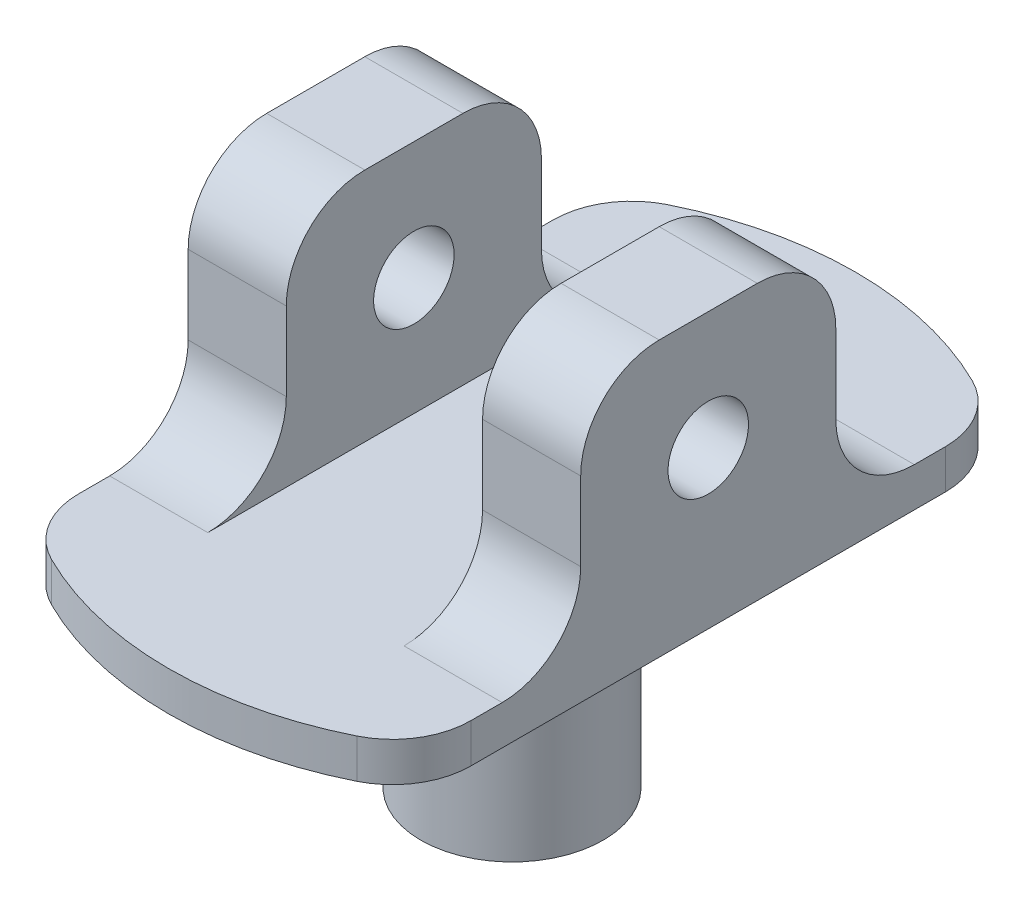
ISO-10303-21;
HEADER;
FILE_DESCRIPTION(('STEP AP214'),'2;1');
FILE_NAME('part.step','',(''),(''),'','','');
FILE_SCHEMA(('AUTOMOTIVE_DESIGN { 1 0 10303 214 1 1 1 1 }'));
ENDSEC;
DATA;
#1=APPLICATION_CONTEXT('core data for automotive mechanical design processes');
#2=APPLICATION_PROTOCOL_DEFINITION('international standard','automotive_design',2000,#1);
#3=PRODUCT_CONTEXT('',#1,'mechanical');
#4=PRODUCT('Part','Part','',(#3));
#5=PRODUCT_RELATED_PRODUCT_CATEGORY('part','',(#4));
#6=PRODUCT_DEFINITION_FORMATION('','',#4);
#7=PRODUCT_DEFINITION_CONTEXT('part definition',#1,'design');
#8=PRODUCT_DEFINITION('design','',#6,#7);
#9=PRODUCT_DEFINITION_SHAPE('','',#8);
#10=(LENGTH_UNIT() NAMED_UNIT(*) SI_UNIT(.MILLI.,.METRE.));
#11=(NAMED_UNIT(*) PLANE_ANGLE_UNIT() SI_UNIT($,.RADIAN.));
#12=(NAMED_UNIT(*) SI_UNIT($,.STERADIAN.) SOLID_ANGLE_UNIT());
#13=UNCERTAINTY_MEASURE_WITH_UNIT(LENGTH_MEASURE(1.E-05),#10,'distance_accuracy_value','');
#14=(GEOMETRIC_REPRESENTATION_CONTEXT(3) GLOBAL_UNCERTAINTY_ASSIGNED_CONTEXT((#13)) GLOBAL_UNIT_ASSIGNED_CONTEXT((#10,
#11,#12)) REPRESENTATION_CONTEXT('',''));
#15=CARTESIAN_POINT('',(0.,0.,0.));
#16=DIRECTION('',(0.,0.,1.));
#17=DIRECTION('',(1.,0.,0.));
#18=AXIS2_PLACEMENT_3D('',#15,#16,#17);
#19=CARTESIAN_POINT('',(0.,14.,0.));
#20=DIRECTION('',(0.,-1.,0.));
#21=DIRECTION('',(0.,0.,-1.));
#22=AXIS2_PLACEMENT_3D('',#19,#20,#21);
#23=CYLINDRICAL_SURFACE('',#22,17.5);
#24=CARTESIAN_POINT('',(0.,14.,0.));
#25=DIRECTION('',(0.,1.,0.));
#26=DIRECTION('',(0.,0.,1.));
#27=AXIS2_PLACEMENT_3D('',#24,#25,#26);
#28=CIRCLE('',#27,17.5);
#29=CARTESIAN_POINT('',(-7.77777777777778,14.,15.6766122883583));
#30=VERTEX_POINT('',#29);
#31=CARTESIAN_POINT('',(7.77777777777778,14.,15.6766122883583));
#32=VERTEX_POINT('',#31);
#33=EDGE_CURVE('E289',#30,#32,#28,.T.);
#34=ORIENTED_EDGE('',*,*,#33,.F.);
#35=DIRECTION('',(0.,-1.,0.));
#36=VECTOR('',#35,1.);
#37=CARTESIAN_POINT('',(-7.77777777777778,14.,15.6766122883583));
#38=LINE('',#37,#36);
#39=CARTESIAN_POINT('',(-7.77777777777778,12.,15.6766122883583));
#40=VERTEX_POINT('',#39);
#41=EDGE_CURVE('E11',#30,#40,#38,.T.);
#42=ORIENTED_EDGE('',*,*,#41,.T.);
#43=CARTESIAN_POINT('',(0.,12.,0.));
#44=DIRECTION('',(0.,1.,0.));
#45=DIRECTION('',(0.,0.,1.));
#46=AXIS2_PLACEMENT_3D('',#43,#44,#45);
#47=CIRCLE('',#46,17.5);
#48=CARTESIAN_POINT('',(7.77777777777778,12.,15.6766122883583));
#49=VERTEX_POINT('',#48);
#50=EDGE_CURVE('E291',#40,#49,#47,.T.);
#51=ORIENTED_EDGE('',*,*,#50,.T.);
#52=DIRECTION('',(0.,-1.,0.));
#53=VECTOR('',#52,1.);
#54=CARTESIAN_POINT('',(7.77777777777778,14.,15.6766122883583));
#55=LINE('',#54,#53);
#56=EDGE_CURVE('E40',#49,#32,#55,.F.);
#57=ORIENTED_EDGE('',*,*,#56,.T.);
#58=EDGE_LOOP('',(#34,#42,#51,#57));
#59=FACE_BOUND('',#58,.T.);
#60=ADVANCED_FACE('F32',(#59),#23,.T.);
#61=CARTESIAN_POINT('',(0.,14.,0.));
#62=DIRECTION('',(0.,1.,0.));
#63=DIRECTION('',(0.,0.,1.));
#64=AXIS2_PLACEMENT_3D('',#61,#62,#63);
#65=PLANE('',#64);
#66=DIRECTION('',(0.,0.,-1.));
#67=VECTOR('',#66,1.);
#68=CARTESIAN_POINT('',(10.,14.,0.));
#69=LINE('',#68,#67);
#70=CARTESIAN_POINT('',(10.,14.,-10.5));
#71=VERTEX_POINT('',#70);
#72=CARTESIAN_POINT('',(10.,14.,-12.0933866224478));
#73=VERTEX_POINT('',#72);
#74=EDGE_CURVE('E403',#71,#73,#69,.T.);
#75=ORIENTED_EDGE('',*,*,#74,.T.);
#76=CARTESIAN_POINT('',(6.,14.,-12.0933866224478));
#77=DIRECTION('',(0.,1.,0.));
#78=DIRECTION('',(0.,0.,1.));
#79=AXIS2_PLACEMENT_3D('',#76,#77,#78);
#80=CIRCLE('',#79,4.);
#81=CARTESIAN_POINT('',(7.77777777777777,14.,-15.6766122883583));
#82=VERTEX_POINT('',#81);
#83=EDGE_CURVE('E266',#73,#82,#80,.T.);
#84=ORIENTED_EDGE('',*,*,#83,.T.);
#85=CARTESIAN_POINT('',(-7.77777777777777,14.,-15.6766122883583));
#86=VERTEX_POINT('',#85);
#87=EDGE_CURVE('E296',#82,#86,#28,.T.);
#88=ORIENTED_EDGE('',*,*,#87,.T.);
#89=CARTESIAN_POINT('',(-6.,14.,-12.0933866224478));
#90=DIRECTION('',(0.,1.,0.));
#91=DIRECTION('',(0.,0.,1.));
#92=AXIS2_PLACEMENT_3D('',#89,#90,#91);
#93=CIRCLE('',#92,4.);
#94=CARTESIAN_POINT('',(-10.,14.,-12.0933866224478));
#95=VERTEX_POINT('',#94);
#96=EDGE_CURVE('E201',#86,#95,#93,.T.);
#97=ORIENTED_EDGE('',*,*,#96,.T.);
#98=DIRECTION('',(0.,0.,-1.));
#99=VECTOR('',#98,1.);
#100=CARTESIAN_POINT('',(-10.,14.,0.));
#101=LINE('',#100,#99);
#102=CARTESIAN_POINT('',(-10.,14.,-10.5));
#103=VERTEX_POINT('',#102);
#104=EDGE_CURVE('E193',#103,#95,#101,.T.);
#105=ORIENTED_EDGE('',*,*,#104,.F.);
#106=DIRECTION('',(-1.,0.,0.));
#107=VECTOR('',#106,1.);
#108=CARTESIAN_POINT('',(0.,14.,-10.5));
#109=LINE('',#108,#107);
#110=CARTESIAN_POINT('',(-5.,14.,-10.5));
#111=VERTEX_POINT('',#110);
#112=EDGE_CURVE('E198',#103,#111,#109,.F.);
#113=ORIENTED_EDGE('',*,*,#112,.T.);
#114=DIRECTION('',(0.,0.,1.));
#115=VECTOR('',#114,1.);
#116=CARTESIAN_POINT('',(-5.,14.,-6.5));
#117=LINE('',#116,#115);
#118=CARTESIAN_POINT('',(-5.,14.,10.5));
#119=VERTEX_POINT('',#118);
#120=EDGE_CURVE('E392',#111,#119,#117,.T.);
#121=ORIENTED_EDGE('',*,*,#120,.T.);
#122=DIRECTION('',(-1.,0.,0.));
#123=VECTOR('',#122,1.);
#124=CARTESIAN_POINT('',(-10.,14.,10.5));
#125=LINE('',#124,#123);
#126=CARTESIAN_POINT('',(-10.,14.,10.5));
#127=VERTEX_POINT('',#126);
#128=EDGE_CURVE('E218',#119,#127,#125,.T.);
#129=ORIENTED_EDGE('',*,*,#128,.T.);
#130=CARTESIAN_POINT('',(-10.,14.,12.0933866224478));
#131=VERTEX_POINT('',#130);
#132=EDGE_CURVE('E202',#131,#127,#101,.T.);
#133=ORIENTED_EDGE('',*,*,#132,.F.);
#134=CARTESIAN_POINT('',(-6.,14.,12.0933866224478));
#135=DIRECTION('',(0.,1.,0.));
#136=DIRECTION('',(0.,0.,1.));
#137=AXIS2_PLACEMENT_3D('',#134,#135,#136);
#138=CIRCLE('',#137,4.);
#139=EDGE_CURVE('E263',#131,#30,#138,.T.);
#140=ORIENTED_EDGE('',*,*,#139,.T.);
#141=ORIENTED_EDGE('',*,*,#33,.T.);
#142=CARTESIAN_POINT('',(6.,14.,12.0933866224478));
#143=DIRECTION('',(0.,1.,0.));
#144=DIRECTION('',(0.,0.,1.));
#145=AXIS2_PLACEMENT_3D('',#142,#143,#144);
#146=CIRCLE('',#145,4.);
#147=CARTESIAN_POINT('',(10.,14.,12.0933866224478));
#148=VERTEX_POINT('',#147);
#149=EDGE_CURVE('E261',#32,#148,#146,.T.);
#150=ORIENTED_EDGE('',*,*,#149,.T.);
#151=CARTESIAN_POINT('',(10.,14.,10.5));
#152=VERTEX_POINT('',#151);
#153=EDGE_CURVE('E350',#148,#152,#69,.T.);
#154=ORIENTED_EDGE('',*,*,#153,.T.);
#155=DIRECTION('',(1.,0.,0.));
#156=VECTOR('',#155,1.);
#157=CARTESIAN_POINT('',(0.,14.,10.5));
#158=LINE('',#157,#156);
#159=CARTESIAN_POINT('',(5.,14.,10.5));
#160=VERTEX_POINT('',#159);
#161=EDGE_CURVE('E224',#152,#160,#158,.F.);
#162=ORIENTED_EDGE('',*,*,#161,.T.);
#163=DIRECTION('',(0.,0.,1.));
#164=VECTOR('',#163,1.);
#165=CARTESIAN_POINT('',(5.,14.,-6.5));
#166=LINE('',#165,#164);
#167=CARTESIAN_POINT('',(5.,14.,-10.5));
#168=VERTEX_POINT('',#167);
#169=EDGE_CURVE('E349',#168,#160,#166,.T.);
#170=ORIENTED_EDGE('',*,*,#169,.F.);
#171=DIRECTION('',(1.,0.,0.));
#172=VECTOR('',#171,1.);
#173=CARTESIAN_POINT('',(10.,14.,-10.5));
#174=LINE('',#173,#172);
#175=EDGE_CURVE('E217',#168,#71,#174,.T.);
#176=ORIENTED_EDGE('',*,*,#175,.T.);
#177=EDGE_LOOP('',(#75,#84,#88,#97,#105,#113,#121,#129,#133,#140,#141,#150,#154,#162,#170,#176));
#178=FACE_BOUND('',#177,.T.);
#179=ADVANCED_FACE('F196',(#178),#65,.T.);
#180=ORIENTED_EDGE('',*,*,#87,.F.);
#181=DIRECTION('',(0.,-1.,0.));
#182=VECTOR('',#181,1.);
#183=CARTESIAN_POINT('',(7.77777777777778,14.,-15.6766122883583));
#184=LINE('',#183,#182);
#185=CARTESIAN_POINT('',(7.77777777777777,12.,-15.6766122883583));
#186=VERTEX_POINT('',#185);
#187=EDGE_CURVE('E271',#82,#186,#184,.T.);
#188=ORIENTED_EDGE('',*,*,#187,.T.);
#189=CARTESIAN_POINT('',(-7.77777777777777,12.,-15.6766122883583));
#190=VERTEX_POINT('',#189);
#191=EDGE_CURVE('E297',#186,#190,#47,.T.);
#192=ORIENTED_EDGE('',*,*,#191,.T.);
#193=DIRECTION('',(0.,-1.,0.));
#194=VECTOR('',#193,1.);
#195=CARTESIAN_POINT('',(-7.77777777777778,14.,-15.6766122883583));
#196=LINE('',#195,#194);
#197=EDGE_CURVE('E268',#190,#86,#196,.F.);
#198=ORIENTED_EDGE('',*,*,#197,.T.);
#199=EDGE_LOOP('',(#180,#188,#192,#198));
#200=FACE_BOUND('',#199,.T.);
#201=ADVANCED_FACE('F429',(#200),#23,.T.);
#202=CARTESIAN_POINT('',(0.,12.,0.));
#203=DIRECTION('',(0.,1.,0.));
#204=DIRECTION('',(0.,0.,1.));
#205=AXIS2_PLACEMENT_3D('',#202,#203,#204);
#206=PLANE('',#205);
#207=CARTESIAN_POINT('',(0.,12.,0.));
#208=DIRECTION('',(0.,1.,0.));
#209=DIRECTION('',(0.,0.,1.));
#210=AXIS2_PLACEMENT_3D('',#207,#208,#209);
#211=CIRCLE('',#210,4.65);
#212=CARTESIAN_POINT('',(0.,12.,4.65));
#213=VERTEX_POINT('',#212);
#214=EDGE_CURVE('E306',#213,#213,#211,.T.);
#215=ORIENTED_EDGE('',*,*,#214,.T.);
#216=EDGE_LOOP('',(#215));
#217=FACE_BOUND('',#216,.T.);
#218=ORIENTED_EDGE('',*,*,#191,.F.);
#219=CARTESIAN_POINT('',(6.,12.,-12.0933866224478));
#220=DIRECTION('',(0.,1.,0.));
#221=DIRECTION('',(0.,0.,1.));
#222=AXIS2_PLACEMENT_3D('',#219,#220,#221);
#223=CIRCLE('',#222,4.);
#224=CARTESIAN_POINT('',(10.,12.,-12.0933866224478));
#225=VERTEX_POINT('',#224);
#226=EDGE_CURVE('E278',#186,#225,#223,.F.);
#227=ORIENTED_EDGE('',*,*,#226,.T.);
#228=DIRECTION('',(0.,0.,-1.));
#229=VECTOR('',#228,1.);
#230=CARTESIAN_POINT('',(10.,12.,0.));
#231=LINE('',#230,#229);
#232=CARTESIAN_POINT('',(10.,12.,12.0933866224478));
#233=VERTEX_POINT('',#232);
#234=EDGE_CURVE('E395',#233,#225,#231,.T.);
#235=ORIENTED_EDGE('',*,*,#234,.F.);
#236=CARTESIAN_POINT('',(6.,12.,12.0933866224478));
#237=DIRECTION('',(0.,1.,0.));
#238=DIRECTION('',(0.,0.,1.));
#239=AXIS2_PLACEMENT_3D('',#236,#237,#238);
#240=CIRCLE('',#239,4.);
#241=EDGE_CURVE('E273',#233,#49,#240,.F.);
#242=ORIENTED_EDGE('',*,*,#241,.T.);
#243=ORIENTED_EDGE('',*,*,#50,.F.);
#244=CARTESIAN_POINT('',(-6.,12.,12.0933866224478));
#245=DIRECTION('',(0.,1.,0.));
#246=DIRECTION('',(0.,0.,1.));
#247=AXIS2_PLACEMENT_3D('',#244,#245,#246);
#248=CIRCLE('',#247,4.);
#249=CARTESIAN_POINT('',(-10.,12.,12.0933866224478));
#250=VERTEX_POINT('',#249);
#251=EDGE_CURVE('E54',#40,#250,#248,.F.);
#252=ORIENTED_EDGE('',*,*,#251,.T.);
#253=DIRECTION('',(0.,0.,-1.));
#254=VECTOR('',#253,1.);
#255=CARTESIAN_POINT('',(-10.,12.,0.));
#256=LINE('',#255,#254);
#257=CARTESIAN_POINT('',(-10.,12.,-12.0933866224478));
#258=VERTEX_POINT('',#257);
#259=EDGE_CURVE('E404',#250,#258,#256,.T.);
#260=ORIENTED_EDGE('',*,*,#259,.T.);
#261=CARTESIAN_POINT('',(-6.,12.,-12.0933866224478));
#262=DIRECTION('',(0.,1.,0.));
#263=DIRECTION('',(0.,0.,1.));
#264=AXIS2_PLACEMENT_3D('',#261,#262,#263);
#265=CIRCLE('',#264,4.);
#266=EDGE_CURVE('E276',#258,#190,#265,.F.);
#267=ORIENTED_EDGE('',*,*,#266,.T.);
#268=EDGE_LOOP('',(#218,#227,#235,#242,#243,#252,#260,#267));
#269=FACE_BOUND('',#268,.T.);
#270=ADVANCED_FACE('F435',(#217,#269),#206,.F.);
#271=CARTESIAN_POINT('',(0.,12.,0.));
#272=DIRECTION('',(0.,-1.,0.));
#273=DIRECTION('',(0.,0.,-1.));
#274=AXIS2_PLACEMENT_3D('',#271,#272,#273);
#275=CYLINDRICAL_SURFACE('',#274,4.65);
#276=ORIENTED_EDGE('',*,*,#214,.F.);
#277=EDGE_LOOP('',(#276));
#278=FACE_BOUND('',#277,.T.);
#279=CARTESIAN_POINT('',(0.,0.,0.));
#280=DIRECTION('',(0.,1.,0.));
#281=DIRECTION('',(0.,0.,1.));
#282=AXIS2_PLACEMENT_3D('',#279,#280,#281);
#283=CIRCLE('',#282,4.65);
#284=CARTESIAN_POINT('',(0.,0.,4.65));
#285=VERTEX_POINT('',#284);
#286=EDGE_CURVE('E299',#285,#285,#283,.T.);
#287=ORIENTED_EDGE('',*,*,#286,.T.);
#288=EDGE_LOOP('',(#287));
#289=FACE_BOUND('',#288,.T.);
#290=ADVANCED_FACE('F455',(#278,#289),#275,.T.);
#291=CARTESIAN_POINT('',(0.,0.,0.));
#292=DIRECTION('',(0.,1.,0.));
#293=DIRECTION('',(0.,0.,1.));
#294=AXIS2_PLACEMENT_3D('',#291,#292,#293);
#295=PLANE('',#294);
#296=ORIENTED_EDGE('',*,*,#286,.F.);
#297=EDGE_LOOP('',(#296));
#298=FACE_BOUND('',#297,.T.);
#299=ADVANCED_FACE('F460',(#298),#295,.F.);
#300=CARTESIAN_POINT('',(5.,26.,-6.5));
#301=DIRECTION('',(1.,0.,0.));
#302=DIRECTION('',(0.,0.,-1.));
#303=AXIS2_PLACEMENT_3D('',#300,#301,#302);
#304=PLANE('',#303);
#305=CARTESIAN_POINT('',(5.,20.,0.));
#306=DIRECTION('',(1.,0.,0.));
#307=DIRECTION('',(0.,0.,-1.));
#308=AXIS2_PLACEMENT_3D('',#305,#306,#307);
#309=CIRCLE('',#308,2.05);
#310=CARTESIAN_POINT('',(5.,20.,-2.05));
#311=VERTEX_POINT('',#310);
#312=EDGE_CURVE('E203',#311,#311,#309,.T.);
#313=ORIENTED_EDGE('',*,*,#312,.T.);
#314=EDGE_LOOP('',(#313));
#315=FACE_BOUND('',#314,.T.);
#316=DIRECTION('',(0.,0.,1.));
#317=VECTOR('',#316,1.);
#318=CARTESIAN_POINT('',(5.,26.,-6.5));
#319=LINE('',#318,#317);
#320=CARTESIAN_POINT('',(5.,26.,-2.5));
#321=VERTEX_POINT('',#320);
#322=CARTESIAN_POINT('',(5.,26.,2.5));
#323=VERTEX_POINT('',#322);
#324=EDGE_CURVE('E376',#321,#323,#319,.T.);
#325=ORIENTED_EDGE('',*,*,#324,.F.);
#326=CARTESIAN_POINT('',(5.,22.,-2.5));
#327=DIRECTION('',(1.,0.,0.));
#328=DIRECTION('',(0.,0.,-1.));
#329=AXIS2_PLACEMENT_3D('',#326,#327,#328);
#330=CIRCLE('',#329,4.);
#331=CARTESIAN_POINT('',(5.,22.,-6.5));
#332=VERTEX_POINT('',#331);
#333=EDGE_CURVE('E340',#321,#332,#330,.F.);
#334=ORIENTED_EDGE('',*,*,#333,.T.);
#335=DIRECTION('',(0.,-1.,0.));
#336=VECTOR('',#335,1.);
#337=CARTESIAN_POINT('',(5.,26.,-6.5));
#338=LINE('',#337,#336);
#339=CARTESIAN_POINT('',(5.,18.,-6.5));
#340=VERTEX_POINT('',#339);
#341=EDGE_CURVE('E369',#332,#340,#338,.T.);
#342=ORIENTED_EDGE('',*,*,#341,.T.);
#343=CARTESIAN_POINT('',(5.,18.,-10.5));
#344=DIRECTION('',(1.,0.,0.));
#345=DIRECTION('',(0.,0.,-1.));
#346=AXIS2_PLACEMENT_3D('',#343,#344,#345);
#347=CIRCLE('',#346,4.);
#348=EDGE_CURVE('E214',#340,#168,#347,.T.);
#349=ORIENTED_EDGE('',*,*,#348,.T.);
#350=ORIENTED_EDGE('',*,*,#169,.T.);
#351=CARTESIAN_POINT('',(5.,18.,10.5));
#352=DIRECTION('',(1.,0.,0.));
#353=DIRECTION('',(0.,0.,-1.));
#354=AXIS2_PLACEMENT_3D('',#351,#352,#353);
#355=CIRCLE('',#354,4.);
#356=CARTESIAN_POINT('',(5.,18.,6.5));
#357=VERTEX_POINT('',#356);
#358=EDGE_CURVE('E249',#160,#357,#355,.T.);
#359=ORIENTED_EDGE('',*,*,#358,.T.);
#360=DIRECTION('',(0.,-1.,0.));
#361=VECTOR('',#360,1.);
#362=CARTESIAN_POINT('',(5.,26.,6.5));
#363=LINE('',#362,#361);
#364=CARTESIAN_POINT('',(5.,22.,6.5));
#365=VERTEX_POINT('',#364);
#366=EDGE_CURVE('E303',#365,#357,#363,.T.);
#367=ORIENTED_EDGE('',*,*,#366,.F.);
#368=CARTESIAN_POINT('',(5.,22.,2.5));
#369=DIRECTION('',(1.,0.,0.));
#370=DIRECTION('',(0.,0.,-1.));
#371=AXIS2_PLACEMENT_3D('',#368,#369,#370);
#372=CIRCLE('',#371,4.);
#373=EDGE_CURVE('E338',#365,#323,#372,.F.);
#374=ORIENTED_EDGE('',*,*,#373,.T.);
#375=EDGE_LOOP('',(#325,#334,#342,#349,#350,#359,#367,#374));
#376=FACE_BOUND('',#375,.T.);
#377=ADVANCED_FACE('F358',(#315,#376),#304,.F.);
#378=CARTESIAN_POINT('',(5.,26.,6.5));
#379=DIRECTION('',(0.,0.,-1.));
#380=DIRECTION('',(-1.,0.,0.));
#381=AXIS2_PLACEMENT_3D('',#378,#379,#380);
#382=PLANE('',#381);
#383=ORIENTED_EDGE('',*,*,#366,.T.);
#384=DIRECTION('',(1.,0.,0.));
#385=VECTOR('',#384,1.);
#386=CARTESIAN_POINT('',(5.,18.,6.5));
#387=LINE('',#386,#385);
#388=CARTESIAN_POINT('',(10.,18.,6.5));
#389=VERTEX_POINT('',#388);
#390=EDGE_CURVE('E233',#357,#389,#387,.T.);
#391=ORIENTED_EDGE('',*,*,#390,.T.);
#392=DIRECTION('',(0.,-1.,0.));
#393=VECTOR('',#392,1.);
#394=CARTESIAN_POINT('',(10.,26.,6.5));
#395=LINE('',#394,#393);
#396=CARTESIAN_POINT('',(10.,22.,6.5));
#397=VERTEX_POINT('',#396);
#398=EDGE_CURVE('E365',#397,#389,#395,.T.);
#399=ORIENTED_EDGE('',*,*,#398,.F.);
#400=DIRECTION('',(1.,0.,0.));
#401=VECTOR('',#400,1.);
#402=CARTESIAN_POINT('',(5.,22.,6.5));
#403=LINE('',#402,#401);
#404=EDGE_CURVE('E342',#397,#365,#403,.F.);
#405=ORIENTED_EDGE('',*,*,#404,.T.);
#406=EDGE_LOOP('',(#383,#391,#399,#405));
#407=FACE_BOUND('',#406,.T.);
#408=ADVANCED_FACE('F361',(#407),#382,.F.);
#409=CARTESIAN_POINT('',(10.,26.,-6.5));
#410=DIRECTION('',(1.,0.,0.));
#411=DIRECTION('',(0.,0.,-1.));
#412=AXIS2_PLACEMENT_3D('',#409,#410,#411);
#413=PLANE('',#412);
#414=CARTESIAN_POINT('',(10.,20.,0.));
#415=DIRECTION('',(1.,0.,0.));
#416=DIRECTION('',(0.,0.,-1.));
#417=AXIS2_PLACEMENT_3D('',#414,#415,#416);
#418=CIRCLE('',#417,2.05);
#419=CARTESIAN_POINT('',(10.,20.,-2.05));
#420=VERTEX_POINT('',#419);
#421=EDGE_CURVE('E256',#420,#420,#418,.T.);
#422=ORIENTED_EDGE('',*,*,#421,.F.);
#423=EDGE_LOOP('',(#422));
#424=FACE_BOUND('',#423,.T.);
#425=ORIENTED_EDGE('',*,*,#234,.T.);
#426=DIRECTION('',(0.,1.,0.));
#427=VECTOR('',#426,1.);
#428=CARTESIAN_POINT('',(10.,14.,-12.0933866224478));
#429=LINE('',#428,#427);
#430=EDGE_CURVE('E258',#225,#73,#429,.T.);
#431=ORIENTED_EDGE('',*,*,#430,.T.);
#432=ORIENTED_EDGE('',*,*,#74,.F.);
#433=CARTESIAN_POINT('',(10.,18.,-10.5));
#434=DIRECTION('',(1.,0.,0.));
#435=DIRECTION('',(0.,0.,-1.));
#436=AXIS2_PLACEMENT_3D('',#433,#434,#435);
#437=CIRCLE('',#436,4.);
#438=CARTESIAN_POINT('',(10.,18.,-6.5));
#439=VERTEX_POINT('',#438);
#440=EDGE_CURVE('E236',#71,#439,#437,.F.);
#441=ORIENTED_EDGE('',*,*,#440,.T.);
#442=DIRECTION('',(0.,-1.,0.));
#443=VECTOR('',#442,1.);
#444=CARTESIAN_POINT('',(10.,26.,-6.5));
#445=LINE('',#444,#443);
#446=CARTESIAN_POINT('',(10.,22.,-6.5));
#447=VERTEX_POINT('',#446);
#448=EDGE_CURVE('E366',#447,#439,#445,.T.);
#449=ORIENTED_EDGE('',*,*,#448,.F.);
#450=CARTESIAN_POINT('',(10.,22.,-2.5));
#451=DIRECTION('',(1.,0.,0.));
#452=DIRECTION('',(0.,0.,-1.));
#453=AXIS2_PLACEMENT_3D('',#450,#451,#452);
#454=CIRCLE('',#453,4.);
#455=CARTESIAN_POINT('',(10.,26.,-2.5));
#456=VERTEX_POINT('',#455);
#457=EDGE_CURVE('E331',#447,#456,#454,.T.);
#458=ORIENTED_EDGE('',*,*,#457,.T.);
#459=DIRECTION('',(0.,0.,1.));
#460=VECTOR('',#459,1.);
#461=CARTESIAN_POINT('',(10.,26.,-6.5));
#462=LINE('',#461,#460);
#463=CARTESIAN_POINT('',(10.,26.,2.5));
#464=VERTEX_POINT('',#463);
#465=EDGE_CURVE('E374',#456,#464,#462,.T.);
#466=ORIENTED_EDGE('',*,*,#465,.T.);
#467=CARTESIAN_POINT('',(10.,22.,2.5));
#468=DIRECTION('',(1.,0.,0.));
#469=DIRECTION('',(0.,0.,-1.));
#470=AXIS2_PLACEMENT_3D('',#467,#468,#469);
#471=CIRCLE('',#470,4.);
#472=EDGE_CURVE('E329',#464,#397,#471,.T.);
#473=ORIENTED_EDGE('',*,*,#472,.T.);
#474=ORIENTED_EDGE('',*,*,#398,.T.);
#475=CARTESIAN_POINT('',(10.,18.,10.5));
#476=DIRECTION('',(1.,0.,0.));
#477=DIRECTION('',(0.,0.,-1.));
#478=AXIS2_PLACEMENT_3D('',#475,#476,#477);
#479=CIRCLE('',#478,4.);
#480=EDGE_CURVE('E246',#389,#152,#479,.F.);
#481=ORIENTED_EDGE('',*,*,#480,.T.);
#482=ORIENTED_EDGE('',*,*,#153,.F.);
#483=DIRECTION('',(0.,1.,0.));
#484=VECTOR('',#483,1.);
#485=CARTESIAN_POINT('',(10.,12.,12.0933866224478));
#486=LINE('',#485,#484);
#487=EDGE_CURVE('E251',#148,#233,#486,.F.);
#488=ORIENTED_EDGE('',*,*,#487,.T.);
#489=EDGE_LOOP('',(#425,#431,#432,#441,#449,#458,#466,#473,#474,#481,#482,#488));
#490=FACE_BOUND('',#489,.T.);
#491=ADVANCED_FACE('F416',(#424,#490),#413,.T.);
#492=CARTESIAN_POINT('',(5.,26.,-6.5));
#493=DIRECTION('',(0.,0.,-1.));
#494=DIRECTION('',(-1.,0.,0.));
#495=AXIS2_PLACEMENT_3D('',#492,#493,#494);
#496=PLANE('',#495);
#497=ORIENTED_EDGE('',*,*,#448,.T.);
#498=DIRECTION('',(1.,0.,0.));
#499=VECTOR('',#498,1.);
#500=CARTESIAN_POINT('',(5.,18.,-6.5));
#501=LINE('',#500,#499);
#502=EDGE_CURVE('E221',#439,#340,#501,.F.);
#503=ORIENTED_EDGE('',*,*,#502,.T.);
#504=ORIENTED_EDGE('',*,*,#341,.F.);
#505=DIRECTION('',(1.,0.,0.));
#506=VECTOR('',#505,1.);
#507=CARTESIAN_POINT('',(5.,22.,-6.5));
#508=LINE('',#507,#506);
#509=EDGE_CURVE('E326',#332,#447,#508,.T.);
#510=ORIENTED_EDGE('',*,*,#509,.T.);
#511=EDGE_LOOP('',(#497,#503,#504,#510));
#512=FACE_BOUND('',#511,.T.);
#513=ADVANCED_FACE('F418',(#512),#496,.T.);
#514=CARTESIAN_POINT('',(0.,26.,0.));
#515=DIRECTION('',(0.,1.,0.));
#516=DIRECTION('',(0.,0.,1.));
#517=AXIS2_PLACEMENT_3D('',#514,#515,#516);
#518=PLANE('',#517);
#519=ORIENTED_EDGE('',*,*,#465,.F.);
#520=DIRECTION('',(1.,0.,0.));
#521=VECTOR('',#520,1.);
#522=CARTESIAN_POINT('',(0.,26.,-2.5));
#523=LINE('',#522,#521);
#524=EDGE_CURVE('E336',#456,#321,#523,.F.);
#525=ORIENTED_EDGE('',*,*,#524,.T.);
#526=ORIENTED_EDGE('',*,*,#324,.T.);
#527=DIRECTION('',(1.,0.,0.));
#528=VECTOR('',#527,1.);
#529=CARTESIAN_POINT('',(10.,26.,2.5));
#530=LINE('',#529,#528);
#531=EDGE_CURVE('E333',#323,#464,#530,.T.);
#532=ORIENTED_EDGE('',*,*,#531,.T.);
#533=EDGE_LOOP('',(#519,#525,#526,#532));
#534=FACE_BOUND('',#533,.T.);
#535=ADVANCED_FACE('F471',(#534),#518,.T.);
#536=CARTESIAN_POINT('',(-5.,26.,-6.5));
#537=DIRECTION('',(1.,0.,0.));
#538=DIRECTION('',(0.,0.,-1.));
#539=AXIS2_PLACEMENT_3D('',#536,#537,#538);
#540=PLANE('',#539);
#541=CARTESIAN_POINT('',(-5.,20.,0.));
#542=DIRECTION('',(1.,0.,0.));
#543=DIRECTION('',(0.,0.,-1.));
#544=AXIS2_PLACEMENT_3D('',#541,#542,#543);
#545=CIRCLE('',#544,2.05);
#546=CARTESIAN_POINT('',(-5.,20.,-2.05));
#547=VERTEX_POINT('',#546);
#548=EDGE_CURVE('E255',#547,#547,#545,.T.);
#549=ORIENTED_EDGE('',*,*,#548,.F.);
#550=EDGE_LOOP('',(#549));
#551=FACE_BOUND('',#550,.T.);
#552=DIRECTION('',(0.,-1.,0.));
#553=VECTOR('',#552,1.);
#554=CARTESIAN_POINT('',(-5.,26.,-6.5));
#555=LINE('',#554,#553);
#556=CARTESIAN_POINT('',(-5.,22.,-6.5));
#557=VERTEX_POINT('',#556);
#558=CARTESIAN_POINT('',(-5.,18.,-6.5));
#559=VERTEX_POINT('',#558);
#560=EDGE_CURVE('E377',#557,#559,#555,.T.);
#561=ORIENTED_EDGE('',*,*,#560,.F.);
#562=CARTESIAN_POINT('',(-5.,22.,-2.5));
#563=DIRECTION('',(1.,0.,0.));
#564=DIRECTION('',(0.,0.,-1.));
#565=AXIS2_PLACEMENT_3D('',#562,#563,#564);
#566=CIRCLE('',#565,4.);
#567=CARTESIAN_POINT('',(-5.,26.,-2.5));
#568=VERTEX_POINT('',#567);
#569=EDGE_CURVE('E324',#557,#568,#566,.T.);
#570=ORIENTED_EDGE('',*,*,#569,.T.);
#571=DIRECTION('',(0.,0.,1.));
#572=VECTOR('',#571,1.);
#573=CARTESIAN_POINT('',(-5.,26.,-6.5));
#574=LINE('',#573,#572);
#575=CARTESIAN_POINT('',(-5.,26.,2.5));
#576=VERTEX_POINT('',#575);
#577=EDGE_CURVE('E394',#568,#576,#574,.T.);
#578=ORIENTED_EDGE('',*,*,#577,.T.);
#579=CARTESIAN_POINT('',(-5.,22.,2.5));
#580=DIRECTION('',(1.,0.,0.));
#581=DIRECTION('',(0.,0.,-1.));
#582=AXIS2_PLACEMENT_3D('',#579,#580,#581);
#583=CIRCLE('',#582,4.);
#584=CARTESIAN_POINT('',(-5.,22.,6.5));
#585=VERTEX_POINT('',#584);
#586=EDGE_CURVE('E322',#576,#585,#583,.T.);
#587=ORIENTED_EDGE('',*,*,#586,.T.);
#588=DIRECTION('',(0.,-1.,0.));
#589=VECTOR('',#588,1.);
#590=CARTESIAN_POINT('',(-5.,26.,6.5));
#591=LINE('',#590,#589);
#592=CARTESIAN_POINT('',(-5.,18.,6.5));
#593=VERTEX_POINT('',#592);
#594=EDGE_CURVE('E388',#585,#593,#591,.T.);
#595=ORIENTED_EDGE('',*,*,#594,.T.);
#596=CARTESIAN_POINT('',(-5.,18.,10.5));
#597=DIRECTION('',(1.,0.,0.));
#598=DIRECTION('',(0.,0.,-1.));
#599=AXIS2_PLACEMENT_3D('',#596,#597,#598);
#600=CIRCLE('',#599,4.);
#601=EDGE_CURVE('E243',#593,#119,#600,.F.);
#602=ORIENTED_EDGE('',*,*,#601,.T.);
#603=ORIENTED_EDGE('',*,*,#120,.F.);
#604=CARTESIAN_POINT('',(-5.,18.,-10.5));
#605=DIRECTION('',(1.,0.,0.));
#606=DIRECTION('',(0.,0.,-1.));
#607=AXIS2_PLACEMENT_3D('',#604,#605,#606);
#608=CIRCLE('',#607,4.);
#609=EDGE_CURVE('E213',#111,#559,#608,.F.);
#610=ORIENTED_EDGE('',*,*,#609,.T.);
#611=EDGE_LOOP('',(#561,#570,#578,#587,#595,#602,#603,#610));
#612=FACE_BOUND('',#611,.T.);
#613=ADVANCED_FACE('F475',(#551,#612),#540,.T.);
#614=CARTESIAN_POINT('',(-5.,26.,-6.5));
#615=DIRECTION('',(0.,0.,1.));
#616=DIRECTION('',(1.,0.,0.));
#617=AXIS2_PLACEMENT_3D('',#614,#615,#616);
#618=PLANE('',#617);
#619=ORIENTED_EDGE('',*,*,#560,.T.);
#620=DIRECTION('',(-1.,0.,0.));
#621=VECTOR('',#620,1.);
#622=CARTESIAN_POINT('',(-5.,18.,-6.5));
#623=LINE('',#622,#621);
#624=CARTESIAN_POINT('',(-10.,18.,-6.5));
#625=VERTEX_POINT('',#624);
#626=EDGE_CURVE('E229',#559,#625,#623,.T.);
#627=ORIENTED_EDGE('',*,*,#626,.T.);
#628=DIRECTION('',(0.,-1.,0.));
#629=VECTOR('',#628,1.);
#630=CARTESIAN_POINT('',(-10.,26.,-6.5));
#631=LINE('',#630,#629);
#632=CARTESIAN_POINT('',(-10.,22.,-6.5));
#633=VERTEX_POINT('',#632);
#634=EDGE_CURVE('E209',#633,#625,#631,.T.);
#635=ORIENTED_EDGE('',*,*,#634,.F.);
#636=DIRECTION('',(-1.,0.,0.));
#637=VECTOR('',#636,1.);
#638=CARTESIAN_POINT('',(-5.,22.,-6.5));
#639=LINE('',#638,#637);
#640=EDGE_CURVE('E320',#633,#557,#639,.F.);
#641=ORIENTED_EDGE('',*,*,#640,.T.);
#642=EDGE_LOOP('',(#619,#627,#635,#641));
#643=FACE_BOUND('',#642,.T.);
#644=ADVANCED_FACE('F479',(#643),#618,.F.);
#645=CARTESIAN_POINT('',(-10.,26.,-6.5));
#646=DIRECTION('',(1.,0.,0.));
#647=DIRECTION('',(0.,0.,-1.));
#648=AXIS2_PLACEMENT_3D('',#645,#646,#647);
#649=PLANE('',#648);
#650=CARTESIAN_POINT('',(-9.99999999999999,20.,0.));
#651=DIRECTION('',(1.,0.,0.));
#652=DIRECTION('',(0.,0.,-1.));
#653=AXIS2_PLACEMENT_3D('',#650,#651,#652);
#654=CIRCLE('',#653,2.05);
#655=CARTESIAN_POINT('',(-9.99999999999999,20.,-2.05));
#656=VERTEX_POINT('',#655);
#657=EDGE_CURVE('E252',#656,#656,#654,.T.);
#658=ORIENTED_EDGE('',*,*,#657,.T.);
#659=EDGE_LOOP('',(#658));
#660=FACE_BOUND('',#659,.T.);
#661=ORIENTED_EDGE('',*,*,#104,.T.);
#662=DIRECTION('',(0.,-1.,0.));
#663=VECTOR('',#662,1.);
#664=CARTESIAN_POINT('',(-10.,26.,-12.0933866224478));
#665=LINE('',#664,#663);
#666=EDGE_CURVE('E47',#95,#258,#665,.T.);
#667=ORIENTED_EDGE('',*,*,#666,.T.);
#668=ORIENTED_EDGE('',*,*,#259,.F.);
#669=DIRECTION('',(0.,-1.,0.));
#670=VECTOR('',#669,1.);
#671=CARTESIAN_POINT('',(-10.,26.,12.0933866224478));
#672=LINE('',#671,#670);
#673=EDGE_CURVE('E280',#250,#131,#672,.F.);
#674=ORIENTED_EDGE('',*,*,#673,.T.);
#675=ORIENTED_EDGE('',*,*,#132,.T.);
#676=CARTESIAN_POINT('',(-10.,18.,10.5));
#677=DIRECTION('',(1.,0.,0.));
#678=DIRECTION('',(0.,0.,-1.));
#679=AXIS2_PLACEMENT_3D('',#676,#677,#678);
#680=CIRCLE('',#679,4.);
#681=CARTESIAN_POINT('',(-10.,18.,6.5));
#682=VERTEX_POINT('',#681);
#683=EDGE_CURVE('E241',#127,#682,#680,.T.);
#684=ORIENTED_EDGE('',*,*,#683,.T.);
#685=DIRECTION('',(0.,-1.,0.));
#686=VECTOR('',#685,1.);
#687=CARTESIAN_POINT('',(-10.,26.,6.5));
#688=LINE('',#687,#686);
#689=CARTESIAN_POINT('',(-10.,22.,6.5));
#690=VERTEX_POINT('',#689);
#691=EDGE_CURVE('E385',#690,#682,#688,.T.);
#692=ORIENTED_EDGE('',*,*,#691,.F.);
#693=CARTESIAN_POINT('',(-10.,22.,2.5));
#694=DIRECTION('',(1.,0.,0.));
#695=DIRECTION('',(0.,0.,-1.));
#696=AXIS2_PLACEMENT_3D('',#693,#694,#695);
#697=CIRCLE('',#696,4.);
#698=CARTESIAN_POINT('',(-10.,26.,2.5));
#699=VERTEX_POINT('',#698);
#700=EDGE_CURVE('E316',#690,#699,#697,.F.);
#701=ORIENTED_EDGE('',*,*,#700,.T.);
#702=DIRECTION('',(0.,0.,1.));
#703=VECTOR('',#702,1.);
#704=CARTESIAN_POINT('',(-10.,26.,-6.5));
#705=LINE('',#704,#703);
#706=CARTESIAN_POINT('',(-10.,26.,-2.5));
#707=VERTEX_POINT('',#706);
#708=EDGE_CURVE('E391',#707,#699,#705,.T.);
#709=ORIENTED_EDGE('',*,*,#708,.F.);
#710=CARTESIAN_POINT('',(-10.,22.,-2.5));
#711=DIRECTION('',(1.,0.,0.));
#712=DIRECTION('',(0.,0.,-1.));
#713=AXIS2_PLACEMENT_3D('',#710,#711,#712);
#714=CIRCLE('',#713,4.);
#715=EDGE_CURVE('E318',#707,#633,#714,.F.);
#716=ORIENTED_EDGE('',*,*,#715,.T.);
#717=ORIENTED_EDGE('',*,*,#634,.T.);
#718=CARTESIAN_POINT('',(-10.,18.,-10.5));
#719=DIRECTION('',(1.,0.,0.));
#720=DIRECTION('',(0.,0.,-1.));
#721=AXIS2_PLACEMENT_3D('',#718,#719,#720);
#722=CIRCLE('',#721,4.);
#723=EDGE_CURVE('E206',#625,#103,#722,.T.);
#724=ORIENTED_EDGE('',*,*,#723,.T.);
#725=EDGE_LOOP('',(#661,#667,#668,#674,#675,#684,#692,#701,#709,#716,#717,#724));
#726=FACE_BOUND('',#725,.T.);
#727=ADVANCED_FACE('F207',(#660,#726),#649,.F.);
#728=CARTESIAN_POINT('',(-5.,26.,6.5));
#729=DIRECTION('',(0.,0.,1.));
#730=DIRECTION('',(1.,0.,0.));
#731=AXIS2_PLACEMENT_3D('',#728,#729,#730);
#732=PLANE('',#731);
#733=ORIENTED_EDGE('',*,*,#691,.T.);
#734=DIRECTION('',(-1.,0.,0.));
#735=VECTOR('',#734,1.);
#736=CARTESIAN_POINT('',(-5.,18.,6.5));
#737=LINE('',#736,#735);
#738=EDGE_CURVE('E231',#682,#593,#737,.F.);
#739=ORIENTED_EDGE('',*,*,#738,.T.);
#740=ORIENTED_EDGE('',*,*,#594,.F.);
#741=DIRECTION('',(-1.,0.,0.));
#742=VECTOR('',#741,1.);
#743=CARTESIAN_POINT('',(-5.,22.,6.5));
#744=LINE('',#743,#742);
#745=EDGE_CURVE('E344',#585,#690,#744,.T.);
#746=ORIENTED_EDGE('',*,*,#745,.T.);
#747=EDGE_LOOP('',(#733,#739,#740,#746));
#748=FACE_BOUND('',#747,.T.);
#749=ADVANCED_FACE('F486',(#748),#732,.T.);
#750=CARTESIAN_POINT('',(0.,26.,0.));
#751=DIRECTION('',(0.,1.,0.));
#752=DIRECTION('',(0.,0.,1.));
#753=AXIS2_PLACEMENT_3D('',#750,#751,#752);
#754=PLANE('',#753);
#755=ORIENTED_EDGE('',*,*,#577,.F.);
#756=DIRECTION('',(-1.,0.,0.));
#757=VECTOR('',#756,1.);
#758=CARTESIAN_POINT('',(-10.,26.,-2.5));
#759=LINE('',#758,#757);
#760=EDGE_CURVE('E313',#568,#707,#759,.T.);
#761=ORIENTED_EDGE('',*,*,#760,.T.);
#762=ORIENTED_EDGE('',*,*,#708,.T.);
#763=DIRECTION('',(-1.,0.,0.));
#764=VECTOR('',#763,1.);
#765=CARTESIAN_POINT('',(0.,26.,2.5));
#766=LINE('',#765,#764);
#767=EDGE_CURVE('E309',#699,#576,#766,.F.);
#768=ORIENTED_EDGE('',*,*,#767,.T.);
#769=EDGE_LOOP('',(#755,#761,#762,#768));
#770=FACE_BOUND('',#769,.T.);
#771=ADVANCED_FACE('F490',(#770),#754,.T.);
#772=CARTESIAN_POINT('',(0.,22.,-2.5));
#773=DIRECTION('',(1.,0.,0.));
#774=DIRECTION('',(0.,0.,-1.));
#775=AXIS2_PLACEMENT_3D('',#772,#773,#774);
#776=CYLINDRICAL_SURFACE('',#775,4.);
#777=ORIENTED_EDGE('',*,*,#569,.F.);
#778=ORIENTED_EDGE('',*,*,#640,.F.);
#779=ORIENTED_EDGE('',*,*,#715,.F.);
#780=ORIENTED_EDGE('',*,*,#760,.F.);
#781=EDGE_LOOP('',(#777,#778,#779,#780));
#782=FACE_BOUND('',#781,.T.);
#783=ADVANCED_FACE('F494',(#782),#776,.T.);
#784=CARTESIAN_POINT('',(5.,22.,-2.5));
#785=DIRECTION('',(1.,0.,0.));
#786=DIRECTION('',(0.,0.,-1.));
#787=AXIS2_PLACEMENT_3D('',#784,#785,#786);
#788=CYLINDRICAL_SURFACE('',#787,4.);
#789=ORIENTED_EDGE('',*,*,#333,.F.);
#790=ORIENTED_EDGE('',*,*,#524,.F.);
#791=ORIENTED_EDGE('',*,*,#457,.F.);
#792=ORIENTED_EDGE('',*,*,#509,.F.);
#793=EDGE_LOOP('',(#789,#790,#791,#792));
#794=FACE_BOUND('',#793,.T.);
#795=ADVANCED_FACE('F638',(#794),#788,.T.);
#796=CARTESIAN_POINT('',(0.,22.,2.5));
#797=DIRECTION('',(-1.,0.,0.));
#798=DIRECTION('',(0.,0.,1.));
#799=AXIS2_PLACEMENT_3D('',#796,#797,#798);
#800=CYLINDRICAL_SURFACE('',#799,4.);
#801=ORIENTED_EDGE('',*,*,#373,.F.);
#802=ORIENTED_EDGE('',*,*,#404,.F.);
#803=ORIENTED_EDGE('',*,*,#472,.F.);
#804=ORIENTED_EDGE('',*,*,#531,.F.);
#805=EDGE_LOOP('',(#801,#802,#803,#804));
#806=FACE_BOUND('',#805,.T.);
#807=ADVANCED_FACE('F646',(#806),#800,.T.);
#808=CARTESIAN_POINT('',(-5.,22.,2.5));
#809=DIRECTION('',(-1.,0.,0.));
#810=DIRECTION('',(0.,0.,1.));
#811=AXIS2_PLACEMENT_3D('',#808,#809,#810);
#812=CYLINDRICAL_SURFACE('',#811,4.);
#813=ORIENTED_EDGE('',*,*,#586,.F.);
#814=ORIENTED_EDGE('',*,*,#767,.F.);
#815=ORIENTED_EDGE('',*,*,#700,.F.);
#816=ORIENTED_EDGE('',*,*,#745,.F.);
#817=EDGE_LOOP('',(#813,#814,#815,#816));
#818=FACE_BOUND('',#817,.T.);
#819=ADVANCED_FACE('F525',(#818),#812,.T.);
#820=CARTESIAN_POINT('',(0.,18.,-10.5));
#821=DIRECTION('',(-1.,0.,0.));
#822=DIRECTION('',(0.,0.,1.));
#823=AXIS2_PLACEMENT_3D('',#820,#821,#822);
#824=CYLINDRICAL_SURFACE('',#823,4.);
#825=ORIENTED_EDGE('',*,*,#348,.F.);
#826=ORIENTED_EDGE('',*,*,#502,.F.);
#827=ORIENTED_EDGE('',*,*,#440,.F.);
#828=ORIENTED_EDGE('',*,*,#175,.F.);
#829=EDGE_LOOP('',(#825,#826,#827,#828));
#830=FACE_BOUND('',#829,.T.);
#831=ADVANCED_FACE('F537',(#830),#824,.F.);
#832=CARTESIAN_POINT('',(-5.,18.,-10.5));
#833=DIRECTION('',(-1.,0.,0.));
#834=DIRECTION('',(0.,0.,1.));
#835=AXIS2_PLACEMENT_3D('',#832,#833,#834);
#836=CYLINDRICAL_SURFACE('',#835,4.);
#837=ORIENTED_EDGE('',*,*,#609,.F.);
#838=ORIENTED_EDGE('',*,*,#112,.F.);
#839=ORIENTED_EDGE('',*,*,#723,.F.);
#840=ORIENTED_EDGE('',*,*,#626,.F.);
#841=EDGE_LOOP('',(#837,#838,#839,#840));
#842=FACE_BOUND('',#841,.T.);
#843=ADVANCED_FACE('F216',(#842),#836,.F.);
#844=CARTESIAN_POINT('',(0.,18.,10.5));
#845=DIRECTION('',(1.,0.,0.));
#846=DIRECTION('',(0.,0.,-1.));
#847=AXIS2_PLACEMENT_3D('',#844,#845,#846);
#848=CYLINDRICAL_SURFACE('',#847,4.);
#849=ORIENTED_EDGE('',*,*,#601,.F.);
#850=ORIENTED_EDGE('',*,*,#738,.F.);
#851=ORIENTED_EDGE('',*,*,#683,.F.);
#852=ORIENTED_EDGE('',*,*,#128,.F.);
#853=EDGE_LOOP('',(#849,#850,#851,#852));
#854=FACE_BOUND('',#853,.T.);
#855=ADVANCED_FACE('F507',(#854),#848,.F.);
#856=CARTESIAN_POINT('',(5.,18.,10.5));
#857=DIRECTION('',(1.,0.,0.));
#858=DIRECTION('',(0.,0.,-1.));
#859=AXIS2_PLACEMENT_3D('',#856,#857,#858);
#860=CYLINDRICAL_SURFACE('',#859,4.);
#861=ORIENTED_EDGE('',*,*,#358,.F.);
#862=ORIENTED_EDGE('',*,*,#161,.F.);
#863=ORIENTED_EDGE('',*,*,#480,.F.);
#864=ORIENTED_EDGE('',*,*,#390,.F.);
#865=EDGE_LOOP('',(#861,#862,#863,#864));
#866=FACE_BOUND('',#865,.T.);
#867=ADVANCED_FACE('F353',(#866),#860,.F.);
#868=CARTESIAN_POINT('',(-60.,20.,0.));
#869=DIRECTION('',(1.,0.,0.));
#870=DIRECTION('',(0.,0.,-1.));
#871=AXIS2_PLACEMENT_3D('',#868,#869,#870);
#872=CYLINDRICAL_SURFACE('',#871,2.05);
#873=ORIENTED_EDGE('',*,*,#548,.T.);
#874=EDGE_LOOP('',(#873));
#875=FACE_BOUND('',#874,.T.);
#876=ORIENTED_EDGE('',*,*,#657,.F.);
#877=EDGE_LOOP('',(#876));
#878=FACE_BOUND('',#877,.T.);
#879=ADVANCED_FACE('F497',(#875,#878),#872,.F.);
#880=ORIENTED_EDGE('',*,*,#421,.T.);
#881=EDGE_LOOP('',(#880));
#882=FACE_BOUND('',#881,.T.);
#883=ORIENTED_EDGE('',*,*,#312,.F.);
#884=EDGE_LOOP('',(#883));
#885=FACE_BOUND('',#884,.T.);
#886=ADVANCED_FACE('F413',(#882,#885),#872,.F.);
#887=CARTESIAN_POINT('',(6.,14.,-12.0933866224478));
#888=DIRECTION('',(0.,-1.,0.));
#889=DIRECTION('',(0.,0.,-1.));
#890=AXIS2_PLACEMENT_3D('',#887,#888,#889);
#891=CYLINDRICAL_SURFACE('',#890,4.);
#892=ORIENTED_EDGE('',*,*,#226,.F.);
#893=ORIENTED_EDGE('',*,*,#187,.F.);
#894=ORIENTED_EDGE('',*,*,#83,.F.);
#895=ORIENTED_EDGE('',*,*,#430,.F.);
#896=EDGE_LOOP('',(#892,#893,#894,#895));
#897=FACE_BOUND('',#896,.T.);
#898=ADVANCED_FACE('F425',(#897),#891,.T.);
#899=CARTESIAN_POINT('',(-6.,14.,-12.0933866224478));
#900=DIRECTION('',(0.,-1.,0.));
#901=DIRECTION('',(0.,0.,-1.));
#902=AXIS2_PLACEMENT_3D('',#899,#900,#901);
#903=CYLINDRICAL_SURFACE('',#902,4.);
#904=ORIENTED_EDGE('',*,*,#266,.F.);
#905=ORIENTED_EDGE('',*,*,#666,.F.);
#906=ORIENTED_EDGE('',*,*,#96,.F.);
#907=ORIENTED_EDGE('',*,*,#197,.F.);
#908=EDGE_LOOP('',(#904,#905,#906,#907));
#909=FACE_BOUND('',#908,.T.);
#910=ADVANCED_FACE('F434',(#909),#903,.T.);
#911=CARTESIAN_POINT('',(-6.,14.,12.0933866224478));
#912=DIRECTION('',(0.,-1.,0.));
#913=DIRECTION('',(0.,0.,-1.));
#914=AXIS2_PLACEMENT_3D('',#911,#912,#913);
#915=CYLINDRICAL_SURFACE('',#914,4.);
#916=ORIENTED_EDGE('',*,*,#251,.F.);
#917=ORIENTED_EDGE('',*,*,#41,.F.);
#918=ORIENTED_EDGE('',*,*,#139,.F.);
#919=ORIENTED_EDGE('',*,*,#673,.F.);
#920=EDGE_LOOP('',(#916,#917,#918,#919));
#921=FACE_BOUND('',#920,.T.);
#922=ADVANCED_FACE('F438',(#921),#915,.T.);
#923=CARTESIAN_POINT('',(6.,14.,12.0933866224478));
#924=DIRECTION('',(0.,-1.,0.));
#925=DIRECTION('',(0.,0.,-1.));
#926=AXIS2_PLACEMENT_3D('',#923,#924,#925);
#927=CYLINDRICAL_SURFACE('',#926,4.);
#928=ORIENTED_EDGE('',*,*,#241,.F.);
#929=ORIENTED_EDGE('',*,*,#487,.F.);
#930=ORIENTED_EDGE('',*,*,#149,.F.);
#931=ORIENTED_EDGE('',*,*,#56,.F.);
#932=EDGE_LOOP('',(#928,#929,#930,#931));
#933=FACE_BOUND('',#932,.T.);
#934=ADVANCED_FACE('F34',(#933),#927,.T.);
#935=CLOSED_SHELL('',(#60,#179,#201,#270,#290,#299,#377,#408,#491,#513,#535,#613,#644,#727,#749,
#771,#783,#795,#807,#819,#831,#843,#855,#867,#879,#886,#898,#910,#922,#934));
#936=MANIFOLD_SOLID_BREP('B2',#935);
#937=ADVANCED_BREP_SHAPE_REPRESENTATION('',(#18,#936),#14);
#938=SHAPE_DEFINITION_REPRESENTATION(#9,#937);
ENDSEC;
END-ISO-10303-21;
